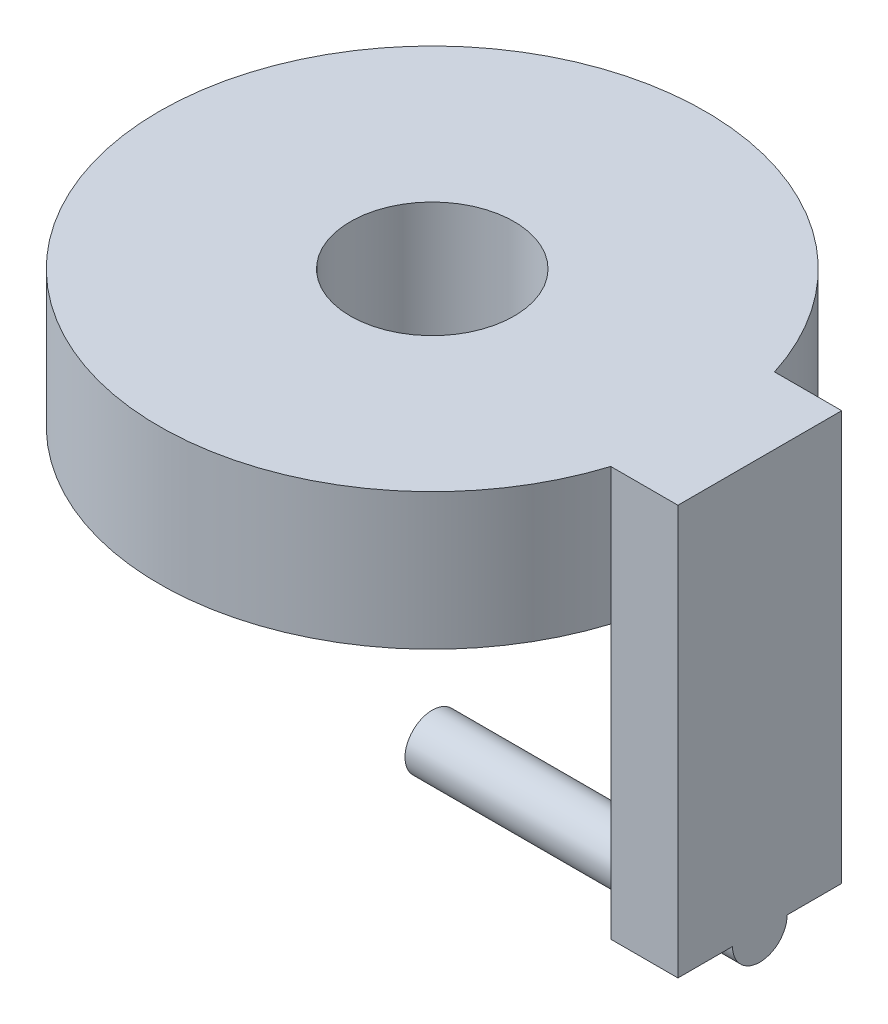
ISO-10303-21;
HEADER;
FILE_DESCRIPTION(('STEP AP214'),'2;1');
FILE_NAME('part.step','',(''),(''),'','','');
FILE_SCHEMA(('AUTOMOTIVE_DESIGN { 1 0 10303 214 1 1 1 1 }'));
ENDSEC;
DATA;
#1=APPLICATION_CONTEXT('core data for automotive mechanical design processes');
#2=APPLICATION_PROTOCOL_DEFINITION('international standard','automotive_design',2000,#1);
#3=PRODUCT_CONTEXT('',#1,'mechanical');
#4=PRODUCT('Part','Part','',(#3));
#5=PRODUCT_RELATED_PRODUCT_CATEGORY('part','',(#4));
#6=PRODUCT_DEFINITION_FORMATION('','',#4);
#7=PRODUCT_DEFINITION_CONTEXT('part definition',#1,'design');
#8=PRODUCT_DEFINITION('design','',#6,#7);
#9=PRODUCT_DEFINITION_SHAPE('','',#8);
#10=(LENGTH_UNIT() NAMED_UNIT(*) SI_UNIT(.MILLI.,.METRE.));
#11=(NAMED_UNIT(*) PLANE_ANGLE_UNIT() SI_UNIT($,.RADIAN.));
#12=(NAMED_UNIT(*) SI_UNIT($,.STERADIAN.) SOLID_ANGLE_UNIT());
#13=UNCERTAINTY_MEASURE_WITH_UNIT(LENGTH_MEASURE(1.E-05),#10,'distance_accuracy_value','');
#14=(GEOMETRIC_REPRESENTATION_CONTEXT(3) GLOBAL_UNCERTAINTY_ASSIGNED_CONTEXT((#13)) GLOBAL_UNIT_ASSIGNED_CONTEXT((#10,
#11,#12)) REPRESENTATION_CONTEXT('',''));
#15=CARTESIAN_POINT('',(0.,0.,0.));
#16=DIRECTION('',(0.,0.,1.));
#17=DIRECTION('',(1.,0.,0.));
#18=AXIS2_PLACEMENT_3D('',#15,#16,#17);
#19=CARTESIAN_POINT('',(0.,-50.,0.));
#20=DIRECTION('',(0.,-1.,0.));
#21=DIRECTION('',(0.,0.,-1.));
#22=AXIS2_PLACEMENT_3D('',#19,#20,#21);
#23=PLANE('',#22);
#24=DIRECTION('',(1.,0.,0.));
#25=VECTOR('',#24,1.);
#26=CARTESIAN_POINT('',(0.,-50.,-5.));
#27=LINE('',#26,#25);
#28=CARTESIAN_POINT('',(49.749371855331,-50.,-4.99999999999998));
#29=VERTEX_POINT('',#28);
#30=CARTESIAN_POINT('',(60.,-50.,-4.99999999999997));
#31=VERTEX_POINT('',#30);
#32=EDGE_CURVE('E11',#29,#31,#27,.T.);
#33=ORIENTED_EDGE('',*,*,#32,.F.);
#34=CARTESIAN_POINT('',(0.,-50.,0.));
#35=DIRECTION('',(0.,-1.,0.));
#36=DIRECTION('',(0.,0.,-1.));
#37=AXIS2_PLACEMENT_3D('',#34,#35,#36);
#38=CIRCLE('',#37,50.);
#39=CARTESIAN_POINT('',(47.6969600708473,-50.,-15.));
#40=VERTEX_POINT('',#39);
#41=EDGE_CURVE('E142',#40,#29,#38,.T.);
#42=ORIENTED_EDGE('',*,*,#41,.F.);
#43=DIRECTION('',(-1.,0.,0.));
#44=VECTOR('',#43,1.);
#45=CARTESIAN_POINT('',(47.6969600708473,-50.,-15.));
#46=LINE('',#45,#44);
#47=CARTESIAN_POINT('',(60.,-50.,-15.));
#48=VERTEX_POINT('',#47);
#49=EDGE_CURVE('E126',#48,#40,#46,.T.);
#50=ORIENTED_EDGE('',*,*,#49,.F.);
#51=DIRECTION('',(0.,0.,-1.));
#52=VECTOR('',#51,1.);
#53=CARTESIAN_POINT('',(60.,-50.,-15.));
#54=LINE('',#53,#52);
#55=EDGE_CURVE('E127',#31,#48,#54,.T.);
#56=ORIENTED_EDGE('',*,*,#55,.F.);
#57=EDGE_LOOP('',(#33,#42,#50,#56));
#58=FACE_BOUND('',#57,.T.);
#59=ADVANCED_FACE('F45',(#58),#23,.T.);
#60=CARTESIAN_POINT('',(0.,25.,0.));
#61=DIRECTION('',(0.,1.,0.));
#62=DIRECTION('',(0.,0.,1.));
#63=AXIS2_PLACEMENT_3D('',#60,#61,#62);
#64=PLANE('',#63);
#65=CARTESIAN_POINT('',(0.,25.,0.));
#66=DIRECTION('',(0.,1.,0.));
#67=DIRECTION('',(0.,0.,1.));
#68=AXIS2_PLACEMENT_3D('',#65,#66,#67);
#69=CIRCLE('',#68,50.);
#70=CARTESIAN_POINT('',(47.6969600708473,25.,-15.));
#71=VERTEX_POINT('',#70);
#72=CARTESIAN_POINT('',(47.6969600708473,25.,15.));
#73=VERTEX_POINT('',#72);
#74=EDGE_CURVE('E179',#71,#73,#69,.T.);
#75=ORIENTED_EDGE('',*,*,#74,.T.);
#76=DIRECTION('',(1.,0.,0.));
#77=VECTOR('',#76,1.);
#78=CARTESIAN_POINT('',(47.6969600708473,25.,15.));
#79=LINE('',#78,#77);
#80=CARTESIAN_POINT('',(60.,25.,15.));
#81=VERTEX_POINT('',#80);
#82=EDGE_CURVE('E133',#73,#81,#79,.T.);
#83=ORIENTED_EDGE('',*,*,#82,.T.);
#84=DIRECTION('',(0.,0.,-1.));
#85=VECTOR('',#84,1.);
#86=CARTESIAN_POINT('',(60.,25.,-15.));
#87=LINE('',#86,#85);
#88=CARTESIAN_POINT('',(60.,25.,-15.));
#89=VERTEX_POINT('',#88);
#90=EDGE_CURVE('E150',#81,#89,#87,.T.);
#91=ORIENTED_EDGE('',*,*,#90,.T.);
#92=DIRECTION('',(-1.,0.,0.));
#93=VECTOR('',#92,1.);
#94=CARTESIAN_POINT('',(47.6969600708473,25.,-15.));
#95=LINE('',#94,#93);
#96=EDGE_CURVE('E68',#89,#71,#95,.T.);
#97=ORIENTED_EDGE('',*,*,#96,.T.);
#98=EDGE_LOOP('',(#75,#83,#91,#97));
#99=FACE_BOUND('',#98,.T.);
#100=CARTESIAN_POINT('',(0.,25.,0.));
#101=DIRECTION('',(0.,1.,0.));
#102=DIRECTION('',(0.,0.,1.));
#103=AXIS2_PLACEMENT_3D('',#100,#101,#102);
#104=CIRCLE('',#103,15.);
#105=CARTESIAN_POINT('',(0.,25.,15.));
#106=VERTEX_POINT('',#105);
#107=EDGE_CURVE('E171',#106,#106,#104,.T.);
#108=ORIENTED_EDGE('',*,*,#107,.F.);
#109=EDGE_LOOP('',(#108));
#110=FACE_BOUND('',#109,.T.);
#111=ADVANCED_FACE('F198',(#99,#110),#64,.T.);
#112=CARTESIAN_POINT('',(0.,0.,0.));
#113=DIRECTION('',(0.,1.,0.));
#114=DIRECTION('',(0.,0.,1.));
#115=AXIS2_PLACEMENT_3D('',#112,#113,#114);
#116=PLANE('',#115);
#117=CARTESIAN_POINT('',(0.,0.,0.));
#118=DIRECTION('',(0.,1.,0.));
#119=DIRECTION('',(0.,0.,1.));
#120=AXIS2_PLACEMENT_3D('',#117,#118,#119);
#121=CIRCLE('',#120,50.);
#122=CARTESIAN_POINT('',(47.6969600708473,0.,15.));
#123=VERTEX_POINT('',#122);
#124=CARTESIAN_POINT('',(47.6969600708473,0.,-15.));
#125=VERTEX_POINT('',#124);
#126=EDGE_CURVE('E183',#123,#125,#121,.T.);
#127=ORIENTED_EDGE('',*,*,#126,.F.);
#128=EDGE_CURVE('E175',#125,#123,#121,.T.);
#129=ORIENTED_EDGE('',*,*,#128,.F.);
#130=EDGE_LOOP('',(#127,#129));
#131=FACE_BOUND('',#130,.T.);
#132=CARTESIAN_POINT('',(0.,0.,0.));
#133=DIRECTION('',(0.,1.,0.));
#134=DIRECTION('',(0.,0.,1.));
#135=AXIS2_PLACEMENT_3D('',#132,#133,#134);
#136=CIRCLE('',#135,15.);
#137=CARTESIAN_POINT('',(0.,0.,15.));
#138=VERTEX_POINT('',#137);
#139=EDGE_CURVE('E160',#138,#138,#136,.T.);
#140=ORIENTED_EDGE('',*,*,#139,.T.);
#141=EDGE_LOOP('',(#140));
#142=FACE_BOUND('',#141,.T.);
#143=ADVANCED_FACE('F206',(#131,#142),#116,.F.);
#144=CARTESIAN_POINT('',(0.,25.,0.));
#145=DIRECTION('',(0.,-1.,0.));
#146=DIRECTION('',(0.,0.,-1.));
#147=AXIS2_PLACEMENT_3D('',#144,#145,#146);
#148=CYLINDRICAL_SURFACE('',#147,50.);
#149=ORIENTED_EDGE('',*,*,#128,.T.);
#150=DIRECTION('',(0.,-1.,0.));
#151=VECTOR('',#150,1.);
#152=CARTESIAN_POINT('',(47.6969600708473,25.,15.));
#153=LINE('',#152,#151);
#154=EDGE_CURVE('E121',#123,#73,#153,.F.);
#155=ORIENTED_EDGE('',*,*,#154,.T.);
#156=ORIENTED_EDGE('',*,*,#74,.F.);
#157=DIRECTION('',(0.,-1.,0.));
#158=VECTOR('',#157,1.);
#159=CARTESIAN_POINT('',(47.6969600708473,25.,-15.));
#160=LINE('',#159,#158);
#161=EDGE_CURVE('E182',#71,#125,#160,.T.);
#162=ORIENTED_EDGE('',*,*,#161,.T.);
#163=EDGE_LOOP('',(#149,#155,#156,#162));
#164=FACE_BOUND('',#163,.T.);
#165=ADVANCED_FACE('F47',(#164),#148,.T.);
#166=CARTESIAN_POINT('',(0.,25.,0.));
#167=DIRECTION('',(0.,-1.,0.));
#168=DIRECTION('',(0.,0.,-1.));
#169=AXIS2_PLACEMENT_3D('',#166,#167,#168);
#170=CYLINDRICAL_SURFACE('',#169,15.);
#171=ORIENTED_EDGE('',*,*,#107,.T.);
#172=EDGE_LOOP('',(#171));
#173=FACE_BOUND('',#172,.T.);
#174=ORIENTED_EDGE('',*,*,#139,.F.);
#175=EDGE_LOOP('',(#174));
#176=FACE_BOUND('',#175,.T.);
#177=ADVANCED_FACE('F247',(#173,#176),#170,.F.);
#178=CARTESIAN_POINT('',(0.,-50.,0.));
#179=DIRECTION('',(0.,1.,0.));
#180=DIRECTION('',(0.,0.,1.));
#181=AXIS2_PLACEMENT_3D('',#178,#179,#180);
#182=CYLINDRICAL_SURFACE('',#181,50.);
#183=CARTESIAN_POINT('',(49.749371855331,-50.,-4.99999999999998));
#184=CARTESIAN_POINT('',(49.7493714739879,-50.1400984910414,-5.00000137801265));
#185=CARTESIAN_POINT('',(49.7499648645192,-50.2801759525513,-4.99410950132875));
#186=CARTESIAN_POINT('',(49.7523207806819,-50.5593766738861,-4.97058574667102));
#187=CARTESIAN_POINT('',(49.7540835867374,-50.6984996967516,-4.9529510527847));
#188=CARTESIAN_POINT('',(49.758730371628,-50.9748627663046,-4.90604778501378));
#189=CARTESIAN_POINT('',(49.7616152445949,-51.1121012207317,-4.87676993272642));
#190=CARTESIAN_POINT('',(49.7684245439498,-51.383659246445,-4.80678208564668));
#191=CARTESIAN_POINT('',(49.7723493507913,-51.5179777299782,-4.76606790661484));
#192=CARTESIAN_POINT('',(49.7811214960436,-51.7825612659208,-4.67355297319561));
#193=CARTESIAN_POINT('',(49.7859679281928,-51.9128301552197,-4.62176310368341));
#194=CARTESIAN_POINT('',(49.7964498317184,-52.1685822119855,-4.50742487178651));
#195=CARTESIAN_POINT('',(49.8020855934881,-52.2940635964192,-4.44487254796568));
#196=CARTESIAN_POINT('',(49.8139814691518,-52.5392393135137,-4.30950824036609));
#197=CARTESIAN_POINT('',(49.820241223913,-52.6589369167397,-4.23670214819131));
#198=CARTESIAN_POINT('',(49.833213339352,-52.8918293722485,-4.08129001384985));
#199=CARTESIAN_POINT('',(49.8399258668515,-53.0050217989707,-3.99868035100196));
#200=CARTESIAN_POINT('',(49.8536318919189,-53.2243809585466,-3.82401365076813));
#201=CARTESIAN_POINT('',(49.8606261396673,-53.3305266242081,-3.73193021365886));
#202=CARTESIAN_POINT('',(49.8746822607949,-53.5347295063108,-3.53912598644835));
#203=CARTESIAN_POINT('',(49.8817441582155,-53.6327837184414,-3.43840201622493));
#204=CARTESIAN_POINT('',(49.8957312091272,-53.8200406195783,-3.22908697054909));
#205=CARTESIAN_POINT('',(49.9026564059683,-53.9092461519805,-3.12049844179169));
#206=CARTESIAN_POINT('',(49.9161794607368,-54.0782436781392,-2.89614565742536));
#207=CARTESIAN_POINT('',(49.9227771969379,-54.1580321862901,-2.78037876886098));
#208=CARTESIAN_POINT('',(49.9354672050881,-54.3077208860877,-2.54231086820843));
#209=CARTESIAN_POINT('',(49.9415585807929,-54.3776036928058,-2.41999887482732));
#210=CARTESIAN_POINT('',(49.95305247823,-54.5068388127033,-2.1698465878875));
#211=CARTESIAN_POINT('',(49.9584547439725,-54.5661872157608,-2.04200426340684));
#212=CARTESIAN_POINT('',(49.9684119508101,-54.6738716267719,-1.78177823539068));
#213=CARTESIAN_POINT('',(49.9729672205962,-54.7222119082541,-1.64939631724145));
#214=CARTESIAN_POINT('',(49.9811060833905,-54.8075714071238,-1.38098814479934));
#215=CARTESIAN_POINT('',(49.9846893185627,-54.8445864559816,-1.24496056862038));
#216=CARTESIAN_POINT('',(49.9937912974821,-54.9379366417935,-0.833882388769741));
#217=CARTESIAN_POINT('',(49.9977085084183,-54.9770599897618,-0.554665092858833));
#218=CARTESIAN_POINT('',(50.0007876636083,-55.007890519289,0.00624616004481936));
#219=CARTESIAN_POINT('',(49.9999497311561,-54.9995989302486,0.287940052633896));
#220=CARTESIAN_POINT('',(49.9936330634674,-54.9360238587811,0.844932903547275));
#221=CARTESIAN_POINT('',(49.9881709230417,-54.8809084098109,1.12025111715597));
#222=CARTESIAN_POINT('',(49.9732365977921,-54.7254953676497,1.65769893008102));
#223=CARTESIAN_POINT('',(49.9637643608788,-54.6251971875533,1.91982835803125));
#224=CARTESIAN_POINT('',(49.9418468380512,-54.3820859117597,2.42400075872673));
#225=CARTESIAN_POINT('',(49.9293963586015,-54.2391984394639,2.66600763658344));
#226=CARTESIAN_POINT('',(49.9029192356571,-53.9150174562056,3.12266778420222));
#227=CARTESIAN_POINT('',(49.8888925459413,-53.733722818844,3.33732025142289));
#228=CARTESIAN_POINT('',(49.8607646707804,-53.3369288327763,3.73416380023821));
#229=CARTESIAN_POINT('',(49.8466634279516,-53.1212832710248,3.91620871518174));
#230=CARTESIAN_POINT('',(49.8200369971109,-52.6624156792134,4.24153769255963));
#231=CARTESIAN_POINT('',(49.8075118113852,-52.4191936091529,4.38482169876918));
#232=CARTESIAN_POINT('',(49.7854544755204,-51.9119648725871,4.62856091866058));
#233=CARTESIAN_POINT('',(49.7759229565795,-51.6479538374987,4.72900710181734));
#234=CARTESIAN_POINT('',(49.7609450935951,-51.1066969773134,4.88410367923542));
#235=CARTESIAN_POINT('',(49.7554986250941,-50.8294515556962,4.93875546869958));
#236=CARTESIAN_POINT('',(49.7493290263652,-50.2708791022196,5.00052387697536));
#237=CARTESIAN_POINT('',(49.7485855774055,-49.9895748985292,5.00784498433651));
#238=CARTESIAN_POINT('',(49.7518525677133,-49.4297436710323,4.97528123325642));
#239=CARTESIAN_POINT('',(49.7558629427463,-49.1512166097519,4.93539701266269));
#240=CARTESIAN_POINT('',(49.7681672212266,-48.6054420881555,4.8097258769145));
#241=CARTESIAN_POINT('',(49.7764521004679,-48.3381721428633,4.72403565233788));
#242=CARTESIAN_POINT('',(49.7963645515391,-47.8217997430119,4.50928358198603));
#243=CARTESIAN_POINT('',(49.8079921999376,-47.572697704765,4.38022074271952));
#244=CARTESIAN_POINT('',(49.8333292192867,-47.0988001236341,4.08187506852302));
#245=CARTESIAN_POINT('',(49.8470455463444,-46.874090266913,3.91245672874388));
#246=CARTESIAN_POINT('',(49.8749916256484,-46.456224756886,3.53840243770981));
#247=CARTESIAN_POINT('',(49.8892213906003,-46.2630698851037,3.33376561445493));
#248=CARTESIAN_POINT('',(49.9166524134836,-45.9130917458927,2.89419988100487));
#249=CARTESIAN_POINT('',(49.9298497813476,-45.756401876398,2.65916449432986));
#250=CARTESIAN_POINT('',(49.9536720267587,-45.4847209831343,2.16598537264715));
#251=CARTESIAN_POINT('',(49.9642969395534,-45.3697293880067,1.90784195433104));
#252=CARTESIAN_POINT('',(49.9817608134462,-45.1849299483584,1.37629260849049));
#253=CARTESIAN_POINT('',(49.9886065219256,-45.1150415387617,1.10291484771761));
#254=CARTESIAN_POINT('',(49.99776363907,-45.0221891765859,0.548079411705814));
#255=CARTESIAN_POINT('',(50.0000751751691,-44.9992239052191,0.266621963774177));
#256=CARTESIAN_POINT('',(49.9999593967711,-45.0004181638621,-0.154560631877522));
#257=CARTESIAN_POINT('',(49.9993276094659,-45.0067169382952,-0.294557002326088));
#258=CARTESIAN_POINT('',(49.9969046663024,-45.0310308401634,-0.573504458936753));
#259=CARTESIAN_POINT('',(49.9951139407924,-45.0490416185947,-0.712455913740111));
#260=CARTESIAN_POINT('',(49.9904208009026,-45.096661979718,-0.988379892074245));
#261=CARTESIAN_POINT('',(49.9875179794045,-45.1262758101695,-1.12535167180308));
#262=CARTESIAN_POINT('',(49.9806844280751,-45.1968707455483,-1.39625643078086));
#263=CARTESIAN_POINT('',(49.9767540742154,-45.2378476930706,-1.53019050208042));
#264=CARTESIAN_POINT('',(49.967974366883,-45.3308881730006,-1.79415256649363));
#265=CARTESIAN_POINT('',(49.963124807464,-45.3829541902162,-1.92417967668242));
#266=CARTESIAN_POINT('',(49.952645478799,-45.4977721600495,-2.17933687671622));
#267=CARTESIAN_POINT('',(49.9470159947868,-45.5605202079479,-2.30446873549388));
#268=CARTESIAN_POINT('',(49.9351311532279,-45.696292795309,-2.54905381442008));
#269=CARTESIAN_POINT('',(49.9288755748083,-45.7693209650998,-2.66850500847287));
#270=CARTESIAN_POINT('',(49.9159178406001,-45.9250922303738,-2.90080624471958));
#271=CARTESIAN_POINT('',(49.9092158475405,-46.0078317941113,-3.01365866446034));
#272=CARTESIAN_POINT('',(49.89551955036,-46.182865549611,-3.23252356376646));
#273=CARTESIAN_POINT('',(49.8885240518713,-46.2752016200178,-3.33850247977285));
#274=CARTESIAN_POINT('',(49.8744696846306,-46.4684274363558,-3.5422736923616));
#275=CARTESIAN_POINT('',(49.8674108399346,-46.5693140486515,-3.6400689622284));
#276=CARTESIAN_POINT('',(49.8534223720552,-46.7790262721525,-3.82688647618721));
#277=CARTESIAN_POINT('',(49.84649283014,-46.8878566782074,-3.91590334417575));
#278=CARTESIAN_POINT('',(49.8329662289085,-47.1125968133744,-4.08443675458967));
#279=CARTESIAN_POINT('',(49.8263690477851,-47.2285039139886,-4.16395679237154));
#280=CARTESIAN_POINT('',(49.8136731501774,-47.4669688391178,-4.31318841414869));
#281=CARTESIAN_POINT('',(49.807575945768,-47.589545098902,-4.38287067354806));
#282=CARTESIAN_POINT('',(49.7960782991411,-47.8401224251779,-4.5116254370604));
#283=CARTESIAN_POINT('',(49.7906776019673,-47.968121483732,-4.57070182657142));
#284=CARTESIAN_POINT('',(49.7807295606041,-48.2285741166492,-4.67780484539495));
#285=CARTESIAN_POINT('',(49.7761815177806,-48.3610239383451,-4.72584052841936));
#286=CARTESIAN_POINT('',(49.7680650371174,-48.6294873713983,-4.81056224313696));
#287=CARTESIAN_POINT('',(49.7644963586299,-48.7655000982709,-4.84725106324239));
#288=CARTESIAN_POINT('',(49.7575042744209,-49.0826657996748,-4.91858203515324));
#289=CARTESIAN_POINT('',(49.7544669050514,-49.2647737547451,-4.94908441090258));
#290=CARTESIAN_POINT('',(49.7504009506177,-49.6312666168424,-4.98979244409663));
#291=CARTESIAN_POINT('',(49.749372357121,-49.8156515143079,-4.99999818674311));
#292=CARTESIAN_POINT('',(49.749371855331,-50.,-4.99999999999998));
#293=B_SPLINE_CURVE_WITH_KNOTS('',3,(#183,#184,#185,#186,#187,#188,#189,#190,#191,#192,#193,
#194,#195,#196,#197,#198,#199,#200,#201,#202,#203,#204,#205,#206,#207,#208,#209,#210,#211,#212,
#213,#214,#215,#216,#217,#218,#219,#220,#221,#222,#223,#224,#225,#226,#227,#228,#229,#230,#231,
#232,#233,#234,#235,#236,#237,#238,#239,#240,#241,#242,#243,#244,#245,#246,#247,#248,#249,#250,
#251,#252,#253,#254,#255,#256,#257,#258,#259,#260,#261,#262,#263,#264,#265,#266,#267,#268,#269,
#270,#271,#272,#273,#274,#275,#276,#277,#278,#279,#280,#281,#282,#283,#284,#285,#286,#287,#288,
#289,#290,#291,#292),.UNSPECIFIED.,.T.,.F.,(4,2,2,2,2,2,2,2,2,2,2,2,2,2,2,2,2,2,2,2,2,2,2,2,2,2,
2,2,2,2,2,2,2,2,2,2,2,2,2,2,2,2,2,2,2,2,2,2,2,2,2,2,2,2,4),(0.,0.420134252377989,
0.840369288708552,1.26093988247999,1.68166455241807,2.10197763072134,2.52244574981762,
2.9426732548295,3.36305644524304,3.78464455225725,4.20638849474177,4.62799647384532,
5.04976002021869,5.4722548499439,5.89490617333059,6.31739313593606,6.7400354186683,
7.58156484320105,8.42307244819018,9.26157288921164,10.1000842223273,10.9400685715992,
11.780077559205,12.6237625525286,13.4674487696567,14.3113127541752,15.1551510280302,
15.9953411136668,16.8355198466221,17.6739320335049,18.5123634263309,19.3536507888645,
20.1949589844387,21.0392981391845,21.8836257241788,22.7264409329966,23.569232453936,
23.9892420866313,24.4090958466629,24.8291034547195,25.2489575975693,25.6689059193386,
26.0887010611433,26.5086448232865,26.9284363348062,27.3501435264971,27.7716968321212,
28.1935067243476,28.6151608857008,29.0380465190118,29.4607769131124,29.8831594088447,
30.3054380244043,30.8582736600065,31.411106974895),.UNSPECIFIED.);
#294=CARTESIAN_POINT('',(49.749371855331,-50.,5.00000000000002));
#295=VERTEX_POINT('',#294);
#296=EDGE_CURVE('E135',#295,#29,#293,.T.);
#297=ORIENTED_EDGE('',*,*,#296,.F.);
#298=CARTESIAN_POINT('',(47.6969600708473,-50.,15.));
#299=VERTEX_POINT('',#298);
#300=EDGE_CURVE('E119',#295,#299,#38,.T.);
#301=ORIENTED_EDGE('',*,*,#300,.T.);
#302=DIRECTION('',(0.,1.,0.));
#303=VECTOR('',#302,1.);
#304=CARTESIAN_POINT('',(47.6969600708473,-50.,15.));
#305=LINE('',#304,#303);
#306=EDGE_CURVE('E161',#299,#123,#305,.T.);
#307=ORIENTED_EDGE('',*,*,#306,.T.);
#308=ORIENTED_EDGE('',*,*,#126,.T.);
#309=DIRECTION('',(0.,1.,0.));
#310=VECTOR('',#309,1.);
#311=CARTESIAN_POINT('',(47.6969600708473,-50.,-15.));
#312=LINE('',#311,#310);
#313=EDGE_CURVE('E165',#40,#125,#312,.T.);
#314=ORIENTED_EDGE('',*,*,#313,.F.);
#315=ORIENTED_EDGE('',*,*,#41,.T.);
#316=EDGE_LOOP('',(#297,#301,#307,#308,#314,#315));
#317=FACE_BOUND('',#316,.T.);
#318=ADVANCED_FACE('F211',(#317),#182,.F.);
#319=CARTESIAN_POINT('',(60.,-50.,-15.));
#320=DIRECTION('',(1.,0.,0.));
#321=DIRECTION('',(0.,0.,-1.));
#322=AXIS2_PLACEMENT_3D('',#319,#320,#321);
#323=PLANE('',#322);
#324=CARTESIAN_POINT('',(60.,-50.,15.));
#325=VERTEX_POINT('',#324);
#326=CARTESIAN_POINT('',(60.,-50.,5.00000000000003));
#327=VERTEX_POINT('',#326);
#328=EDGE_CURVE('E117',#325,#327,#54,.T.);
#329=ORIENTED_EDGE('',*,*,#328,.T.);
#330=CARTESIAN_POINT('',(60.,-50.,0.));
#331=DIRECTION('',(1.,0.,0.));
#332=DIRECTION('',(0.,0.,-1.));
#333=AXIS2_PLACEMENT_3D('',#330,#331,#332);
#334=CIRCLE('',#333,5.);
#335=EDGE_CURVE('E61',#327,#31,#334,.T.);
#336=ORIENTED_EDGE('',*,*,#335,.T.);
#337=ORIENTED_EDGE('',*,*,#55,.T.);
#338=DIRECTION('',(0.,1.,0.));
#339=VECTOR('',#338,1.);
#340=CARTESIAN_POINT('',(60.,-50.,-15.));
#341=LINE('',#340,#339);
#342=EDGE_CURVE('E149',#48,#89,#341,.T.);
#343=ORIENTED_EDGE('',*,*,#342,.T.);
#344=ORIENTED_EDGE('',*,*,#90,.F.);
#345=DIRECTION('',(0.,1.,0.));
#346=VECTOR('',#345,1.);
#347=CARTESIAN_POINT('',(60.,-50.,15.));
#348=LINE('',#347,#346);
#349=EDGE_CURVE('E124',#325,#81,#348,.T.);
#350=ORIENTED_EDGE('',*,*,#349,.F.);
#351=EDGE_LOOP('',(#329,#336,#337,#343,#344,#350));
#352=FACE_BOUND('',#351,.T.);
#353=ADVANCED_FACE('F122',(#352),#323,.T.);
#354=CARTESIAN_POINT('',(47.6969600708473,-50.,15.));
#355=DIRECTION('',(0.,0.,1.));
#356=DIRECTION('',(1.,0.,0.));
#357=AXIS2_PLACEMENT_3D('',#354,#355,#356);
#358=PLANE('',#357);
#359=ORIENTED_EDGE('',*,*,#82,.F.);
#360=ORIENTED_EDGE('',*,*,#154,.F.);
#361=ORIENTED_EDGE('',*,*,#306,.F.);
#362=DIRECTION('',(1.,0.,0.));
#363=VECTOR('',#362,1.);
#364=CARTESIAN_POINT('',(47.6969600708473,-50.,15.));
#365=LINE('',#364,#363);
#366=EDGE_CURVE('E146',#299,#325,#365,.T.);
#367=ORIENTED_EDGE('',*,*,#366,.T.);
#368=ORIENTED_EDGE('',*,*,#349,.T.);
#369=EDGE_LOOP('',(#359,#360,#361,#367,#368));
#370=FACE_BOUND('',#369,.T.);
#371=ADVANCED_FACE('F200',(#370),#358,.T.);
#372=CARTESIAN_POINT('',(47.6969600708473,-50.,-15.));
#373=DIRECTION('',(0.,0.,-1.));
#374=DIRECTION('',(-1.,0.,0.));
#375=AXIS2_PLACEMENT_3D('',#372,#373,#374);
#376=PLANE('',#375);
#377=ORIENTED_EDGE('',*,*,#96,.F.);
#378=ORIENTED_EDGE('',*,*,#342,.F.);
#379=ORIENTED_EDGE('',*,*,#49,.T.);
#380=ORIENTED_EDGE('',*,*,#313,.T.);
#381=ORIENTED_EDGE('',*,*,#161,.F.);
#382=EDGE_LOOP('',(#377,#378,#379,#380,#381));
#383=FACE_BOUND('',#382,.T.);
#384=ADVANCED_FACE('F204',(#383),#376,.T.);
#385=DIRECTION('',(1.,0.,0.));
#386=VECTOR('',#385,1.);
#387=CARTESIAN_POINT('',(0.,-50.,5.));
#388=LINE('',#387,#386);
#389=EDGE_CURVE('E54',#327,#295,#388,.F.);
#390=ORIENTED_EDGE('',*,*,#389,.F.);
#391=ORIENTED_EDGE('',*,*,#328,.F.);
#392=ORIENTED_EDGE('',*,*,#366,.F.);
#393=ORIENTED_EDGE('',*,*,#300,.F.);
#394=EDGE_LOOP('',(#390,#391,#392,#393));
#395=FACE_BOUND('',#394,.T.);
#396=ADVANCED_FACE('F115',(#395),#23,.T.);
#397=CARTESIAN_POINT('',(0.,-50.,0.));
#398=DIRECTION('',(1.,0.,0.));
#399=DIRECTION('',(0.,0.,-1.));
#400=AXIS2_PLACEMENT_3D('',#397,#398,#399);
#401=CYLINDRICAL_SURFACE('',#400,5.);
#402=CARTESIAN_POINT('',(0.,-50.,0.));
#403=DIRECTION('',(1.,0.,0.));
#404=DIRECTION('',(0.,0.,-1.));
#405=AXIS2_PLACEMENT_3D('',#402,#403,#404);
#406=CIRCLE('',#405,5.);
#407=CARTESIAN_POINT('',(0.,-50.,-5.));
#408=VERTEX_POINT('',#407);
#409=EDGE_CURVE('E110',#408,#408,#406,.T.);
#410=ORIENTED_EDGE('',*,*,#409,.T.);
#411=EDGE_LOOP('',(#410));
#412=FACE_BOUND('',#411,.T.);
#413=ORIENTED_EDGE('',*,*,#296,.T.);
#414=ORIENTED_EDGE('',*,*,#32,.T.);
#415=ORIENTED_EDGE('',*,*,#335,.F.);
#416=ORIENTED_EDGE('',*,*,#389,.T.);
#417=EDGE_LOOP('',(#413,#414,#415,#416));
#418=FACE_BOUND('',#417,.T.);
#419=ADVANCED_FACE('F105',(#412,#418),#401,.T.);
#420=CARTESIAN_POINT('',(0.,-50.,0.));
#421=DIRECTION('',(1.,0.,0.));
#422=DIRECTION('',(0.,0.,-1.));
#423=AXIS2_PLACEMENT_3D('',#420,#421,#422);
#424=PLANE('',#423);
#425=ORIENTED_EDGE('',*,*,#409,.F.);
#426=EDGE_LOOP('',(#425));
#427=FACE_BOUND('',#426,.T.);
#428=ADVANCED_FACE('F220',(#427),#424,.F.);
#429=CLOSED_SHELL('',(#59,#111,#143,#165,#177,#318,#353,#371,#384,#396,#419,#428));
#430=MANIFOLD_SOLID_BREP('B2',#429);
#431=ADVANCED_BREP_SHAPE_REPRESENTATION('',(#18,#430),#14);
#432=SHAPE_DEFINITION_REPRESENTATION(#9,#431);
ENDSEC;
END-ISO-10303-21;
